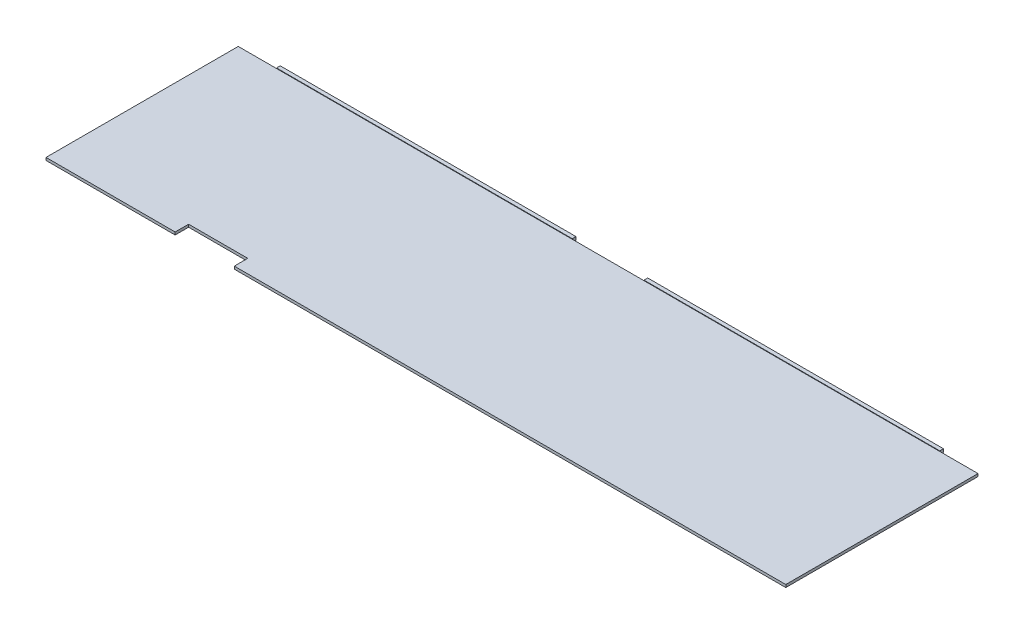
ISO-10303-21;
HEADER;
FILE_DESCRIPTION(('STEP AP214'),'2;1');
FILE_NAME('part.step','',(''),(''),'','','');
FILE_SCHEMA(('AUTOMOTIVE_DESIGN { 1 0 10303 214 1 1 1 1 }'));
ENDSEC;
DATA;
#1=APPLICATION_CONTEXT('core data for automotive mechanical design processes');
#2=APPLICATION_PROTOCOL_DEFINITION('international standard','automotive_design',2000,#1);
#3=PRODUCT_CONTEXT('',#1,'mechanical');
#4=PRODUCT('Part','Part','',(#3));
#5=PRODUCT_RELATED_PRODUCT_CATEGORY('part','',(#4));
#6=PRODUCT_DEFINITION_FORMATION('','',#4);
#7=PRODUCT_DEFINITION_CONTEXT('part definition',#1,'design');
#8=PRODUCT_DEFINITION('design','',#6,#7);
#9=PRODUCT_DEFINITION_SHAPE('','',#8);
#10=(LENGTH_UNIT() NAMED_UNIT(*) SI_UNIT(.MILLI.,.METRE.));
#11=(NAMED_UNIT(*) PLANE_ANGLE_UNIT() SI_UNIT($,.RADIAN.));
#12=(NAMED_UNIT(*) SI_UNIT($,.STERADIAN.) SOLID_ANGLE_UNIT());
#13=UNCERTAINTY_MEASURE_WITH_UNIT(LENGTH_MEASURE(1.E-05),#10,'distance_accuracy_value','');
#14=(GEOMETRIC_REPRESENTATION_CONTEXT(3) GLOBAL_UNCERTAINTY_ASSIGNED_CONTEXT((#13)) GLOBAL_UNIT_ASSIGNED_CONTEXT((#10,
#11,#12)) REPRESENTATION_CONTEXT('',''));
#15=CARTESIAN_POINT('',(0.,0.,0.));
#16=DIRECTION('',(0.,0.,1.));
#17=DIRECTION('',(1.,0.,0.));
#18=AXIS2_PLACEMENT_3D('',#15,#16,#17);
#19=CARTESIAN_POINT('',(-317.6778,1.143,82.55));
#20=DIRECTION('',(0.,0.,-1.));
#21=DIRECTION('',(-1.,0.,0.));
#22=AXIS2_PLACEMENT_3D('',#19,#20,#21);
#23=PLANE('',#22);
#24=DIRECTION('',(0.,1.,0.));
#25=VECTOR('',#24,1.);
#26=CARTESIAN_POINT('',(-155.970930865136,1.143,82.55));
#27=LINE('',#26,#25);
#28=CARTESIAN_POINT('',(-155.970930865136,-1.143,82.55));
#29=VERTEX_POINT('',#28);
#30=CARTESIAN_POINT('',(-155.970930865136,1.143,82.55));
#31=VERTEX_POINT('',#30);
#32=EDGE_CURVE('E187',#29,#31,#27,.T.);
#33=ORIENTED_EDGE('',*,*,#32,.F.);
#34=DIRECTION('',(1.,0.,0.));
#35=VECTOR('',#34,1.);
#36=CARTESIAN_POINT('',(-317.6778,-1.143,82.55));
#37=LINE('',#36,#35);
#38=CARTESIAN_POINT('',(317.6778,-1.143,82.55));
#39=VERTEX_POINT('',#38);
#40=EDGE_CURVE('E278',#29,#39,#37,.T.);
#41=ORIENTED_EDGE('',*,*,#40,.T.);
#42=DIRECTION('',(0.,-1.,0.));
#43=VECTOR('',#42,1.);
#44=CARTESIAN_POINT('',(317.6778,1.143,82.55));
#45=LINE('',#44,#43);
#46=CARTESIAN_POINT('',(317.6778,1.143,82.55));
#47=VERTEX_POINT('',#46);
#48=EDGE_CURVE('E269',#47,#39,#45,.T.);
#49=ORIENTED_EDGE('',*,*,#48,.F.);
#50=DIRECTION('',(1.,0.,0.));
#51=VECTOR('',#50,1.);
#52=CARTESIAN_POINT('',(-317.6778,1.143,82.55));
#53=LINE('',#52,#51);
#54=EDGE_CURVE('E265',#31,#47,#53,.T.);
#55=ORIENTED_EDGE('',*,*,#54,.F.);
#56=EDGE_LOOP('',(#33,#41,#49,#55));
#57=FACE_BOUND('',#56,.T.);
#58=ADVANCED_FACE('F33',(#57),#23,.F.);
#59=CARTESIAN_POINT('',(0.,1.143,0.));
#60=DIRECTION('',(0.,1.,0.));
#61=DIRECTION('',(0.,0.,1.));
#62=AXIS2_PLACEMENT_3D('',#59,#60,#61);
#63=PLANE('',#62);
#64=DIRECTION('',(-1.,0.,0.));
#65=VECTOR('',#64,1.);
#66=CARTESIAN_POINT('',(5.95291989389155E-13,1.143,70.977480805472));
#67=LINE('',#66,#65);
#68=CARTESIAN_POINT('',(-155.970930865136,1.143,70.9774808054733));
#69=VERTEX_POINT('',#68);
#70=CARTESIAN_POINT('',(-206.770930865136,1.143,70.9774808054754));
#71=VERTEX_POINT('',#70);
#72=EDGE_CURVE('E166',#69,#71,#67,.T.);
#73=ORIENTED_EDGE('',*,*,#72,.F.);
#74=DIRECTION('',(0.,0.,1.));
#75=VECTOR('',#74,1.);
#76=CARTESIAN_POINT('',(-155.970930865136,1.143,0.));
#77=LINE('',#76,#75);
#78=EDGE_CURVE('E184',#69,#31,#77,.T.);
#79=ORIENTED_EDGE('',*,*,#78,.T.);
#80=ORIENTED_EDGE('',*,*,#54,.T.);
#81=DIRECTION('',(0.,0.,-1.));
#82=VECTOR('',#81,1.);
#83=CARTESIAN_POINT('',(317.6778,1.143,-82.55));
#84=LINE('',#83,#82);
#85=CARTESIAN_POINT('',(317.6778,1.143,-82.55));
#86=VERTEX_POINT('',#85);
#87=EDGE_CURVE('E254',#47,#86,#84,.T.);
#88=ORIENTED_EDGE('',*,*,#87,.T.);
#89=DIRECTION('',(-1.,0.,0.));
#90=VECTOR('',#89,1.);
#91=CARTESIAN_POINT('',(-317.6778,1.143,-82.55));
#92=LINE('',#91,#90);
#93=CARTESIAN_POINT('',(284.822900000001,1.143,-82.55));
#94=VERTEX_POINT('',#93);
#95=EDGE_CURVE('E259',#86,#94,#92,.T.);
#96=ORIENTED_EDGE('',*,*,#95,.T.);
#97=DIRECTION('',(1.,0.,0.));
#98=VECTOR('',#97,1.);
#99=CARTESIAN_POINT('',(0.,1.143,-82.55));
#100=LINE('',#99,#98);
#101=CARTESIAN_POINT('',(30.8229000000014,1.143,-82.55));
#102=VERTEX_POINT('',#101);
#103=EDGE_CURVE('E220',#102,#94,#100,.T.);
#104=ORIENTED_EDGE('',*,*,#103,.F.);
#105=CARTESIAN_POINT('',(-30.8229000000015,1.143,-82.55));
#106=VERTEX_POINT('',#105);
#107=EDGE_CURVE('E56',#102,#106,#92,.T.);
#108=ORIENTED_EDGE('',*,*,#107,.T.);
#109=CARTESIAN_POINT('',(-284.822900000001,1.143,-82.55));
#110=VERTEX_POINT('',#109);
#111=EDGE_CURVE('E263',#106,#110,#92,.T.);
#112=ORIENTED_EDGE('',*,*,#111,.T.);
#113=CARTESIAN_POINT('',(-317.6778,1.143,-82.55));
#114=VERTEX_POINT('',#113);
#115=EDGE_CURVE('E257',#110,#114,#92,.T.);
#116=ORIENTED_EDGE('',*,*,#115,.T.);
#117=DIRECTION('',(0.,0.,1.));
#118=VECTOR('',#117,1.);
#119=CARTESIAN_POINT('',(-317.6778,1.143,-82.55));
#120=LINE('',#119,#118);
#121=CARTESIAN_POINT('',(-317.6778,1.143,82.55));
#122=VERTEX_POINT('',#121);
#123=EDGE_CURVE('E262',#114,#122,#120,.T.);
#124=ORIENTED_EDGE('',*,*,#123,.T.);
#125=CARTESIAN_POINT('',(-206.770930865136,1.143,82.55));
#126=VERTEX_POINT('',#125);
#127=EDGE_CURVE('E266',#122,#126,#53,.T.);
#128=ORIENTED_EDGE('',*,*,#127,.T.);
#129=DIRECTION('',(0.,0.,1.));
#130=VECTOR('',#129,1.);
#131=CARTESIAN_POINT('',(-206.770930865136,1.143,1.00828762200307E-12));
#132=LINE('',#131,#130);
#133=EDGE_CURVE('E179',#71,#126,#132,.T.);
#134=ORIENTED_EDGE('',*,*,#133,.F.);
#135=EDGE_LOOP('',(#73,#79,#80,#88,#96,#104,#108,#112,#116,#124,#128,#134));
#136=FACE_BOUND('',#135,.T.);
#137=ADVANCED_FACE('F315',(#136),#63,.T.);
#138=CARTESIAN_POINT('',(0.,-1.143,0.));
#139=DIRECTION('',(0.,1.,0.));
#140=DIRECTION('',(0.,0.,1.));
#141=AXIS2_PLACEMENT_3D('',#138,#139,#140);
#142=PLANE('',#141);
#143=DIRECTION('',(0.,0.,1.));
#144=VECTOR('',#143,1.);
#145=CARTESIAN_POINT('',(-155.970930865136,-1.143,0.));
#146=LINE('',#145,#144);
#147=CARTESIAN_POINT('',(-155.970930865136,-1.143,70.9774808054733));
#148=VERTEX_POINT('',#147);
#149=EDGE_CURVE('E11',#148,#29,#146,.T.);
#150=ORIENTED_EDGE('',*,*,#149,.F.);
#151=DIRECTION('',(1.,0.,0.));
#152=VECTOR('',#151,1.);
#153=CARTESIAN_POINT('',(5.95291989389155E-13,-1.143,70.977480805472));
#154=LINE('',#153,#152);
#155=CARTESIAN_POINT('',(-206.770930865136,-1.143,70.9774808054754));
#156=VERTEX_POINT('',#155);
#157=EDGE_CURVE('E163',#156,#148,#154,.T.);
#158=ORIENTED_EDGE('',*,*,#157,.F.);
#159=DIRECTION('',(0.,0.,1.));
#160=VECTOR('',#159,1.);
#161=CARTESIAN_POINT('',(-206.770930865136,-1.143,1.00828762200307E-12));
#162=LINE('',#161,#160);
#163=CARTESIAN_POINT('',(-206.770930865136,-1.143,82.55));
#164=VERTEX_POINT('',#163);
#165=EDGE_CURVE('E41',#156,#164,#162,.T.);
#166=ORIENTED_EDGE('',*,*,#165,.T.);
#167=CARTESIAN_POINT('',(-317.6778,-1.143,82.55));
#168=VERTEX_POINT('',#167);
#169=EDGE_CURVE('E258',#168,#164,#37,.T.);
#170=ORIENTED_EDGE('',*,*,#169,.F.);
#171=DIRECTION('',(0.,0.,1.));
#172=VECTOR('',#171,1.);
#173=CARTESIAN_POINT('',(-317.6778,-1.143,-82.55));
#174=LINE('',#173,#172);
#175=CARTESIAN_POINT('',(-317.6778,-1.143,-82.55));
#176=VERTEX_POINT('',#175);
#177=EDGE_CURVE('E275',#176,#168,#174,.T.);
#178=ORIENTED_EDGE('',*,*,#177,.F.);
#179=DIRECTION('',(-1.,0.,0.));
#180=VECTOR('',#179,1.);
#181=CARTESIAN_POINT('',(-317.6778,-1.143,-82.55));
#182=LINE('',#181,#180);
#183=CARTESIAN_POINT('',(-284.822900000001,-1.143,-82.55));
#184=VERTEX_POINT('',#183);
#185=EDGE_CURVE('E272',#184,#176,#182,.T.);
#186=ORIENTED_EDGE('',*,*,#185,.F.);
#187=DIRECTION('',(0.,0.,1.));
#188=VECTOR('',#187,1.);
#189=CARTESIAN_POINT('',(-284.822900000001,-1.143,-85.725));
#190=LINE('',#189,#188);
#191=CARTESIAN_POINT('',(-284.822900000001,-1.143,-85.725));
#192=VERTEX_POINT('',#191);
#193=EDGE_CURVE('E247',#192,#184,#190,.T.);
#194=ORIENTED_EDGE('',*,*,#193,.F.);
#195=DIRECTION('',(-1.,0.,0.));
#196=VECTOR('',#195,1.);
#197=CARTESIAN_POINT('',(-30.8229000000015,-1.143,-85.725));
#198=LINE('',#197,#196);
#199=CARTESIAN_POINT('',(-30.8229000000015,-1.143,-85.725));
#200=VERTEX_POINT('',#199);
#201=EDGE_CURVE('E227',#200,#192,#198,.T.);
#202=ORIENTED_EDGE('',*,*,#201,.F.);
#203=DIRECTION('',(0.,0.,1.));
#204=VECTOR('',#203,1.);
#205=CARTESIAN_POINT('',(-30.8229000000015,-1.143,-85.725));
#206=LINE('',#205,#204);
#207=CARTESIAN_POINT('',(-30.8229000000015,-1.143,-82.55));
#208=VERTEX_POINT('',#207);
#209=EDGE_CURVE('E250',#200,#208,#206,.T.);
#210=ORIENTED_EDGE('',*,*,#209,.T.);
#211=CARTESIAN_POINT('',(30.8229000000015,-1.143,-82.55));
#212=VERTEX_POINT('',#211);
#213=EDGE_CURVE('E276',#212,#208,#182,.T.);
#214=ORIENTED_EDGE('',*,*,#213,.F.);
#215=DIRECTION('',(0.,0.,1.));
#216=VECTOR('',#215,1.);
#217=CARTESIAN_POINT('',(30.8229000000015,-1.143,-85.725));
#218=LINE('',#217,#216);
#219=CARTESIAN_POINT('',(30.8229000000015,-1.143,-85.725));
#220=VERTEX_POINT('',#219);
#221=EDGE_CURVE('E214',#220,#212,#218,.T.);
#222=ORIENTED_EDGE('',*,*,#221,.F.);
#223=DIRECTION('',(-1.,0.,0.));
#224=VECTOR('',#223,1.);
#225=CARTESIAN_POINT('',(284.822900000001,-1.143,-85.725));
#226=LINE('',#225,#224);
#227=CARTESIAN_POINT('',(284.822900000001,-1.143,-85.725));
#228=VERTEX_POINT('',#227);
#229=EDGE_CURVE('E193',#228,#220,#226,.T.);
#230=ORIENTED_EDGE('',*,*,#229,.F.);
#231=DIRECTION('',(0.,0.,1.));
#232=VECTOR('',#231,1.);
#233=CARTESIAN_POINT('',(284.822900000001,-1.143,-85.725));
#234=LINE('',#233,#232);
#235=CARTESIAN_POINT('',(284.822900000001,-1.143,-82.55));
#236=VERTEX_POINT('',#235);
#237=EDGE_CURVE('E217',#228,#236,#234,.T.);
#238=ORIENTED_EDGE('',*,*,#237,.T.);
#239=CARTESIAN_POINT('',(317.6778,-1.143,-82.55));
#240=VERTEX_POINT('',#239);
#241=EDGE_CURVE('E273',#240,#236,#182,.T.);
#242=ORIENTED_EDGE('',*,*,#241,.F.);
#243=DIRECTION('',(0.,0.,-1.));
#244=VECTOR('',#243,1.);
#245=CARTESIAN_POINT('',(317.6778,-1.143,-82.55));
#246=LINE('',#245,#244);
#247=EDGE_CURVE('E253',#39,#240,#246,.T.);
#248=ORIENTED_EDGE('',*,*,#247,.F.);
#249=ORIENTED_EDGE('',*,*,#40,.F.);
#250=EDGE_LOOP('',(#150,#158,#166,#170,#178,#186,#194,#202,#210,#214,#222,#230,#238,#242,#248,#249));
#251=FACE_BOUND('',#250,.T.);
#252=ADVANCED_FACE('F175',(#251),#142,.F.);
#253=CARTESIAN_POINT('',(-317.6778,1.143,-82.55));
#254=DIRECTION('',(0.,0.,1.));
#255=DIRECTION('',(1.,0.,0.));
#256=AXIS2_PLACEMENT_3D('',#253,#254,#255);
#257=PLANE('',#256);
#258=DIRECTION('',(0.,-1.,0.));
#259=VECTOR('',#258,1.);
#260=CARTESIAN_POINT('',(284.822900000001,-1.143,-82.55));
#261=LINE('',#260,#259);
#262=EDGE_CURVE('E189',#94,#236,#261,.T.);
#263=ORIENTED_EDGE('',*,*,#262,.F.);
#264=ORIENTED_EDGE('',*,*,#95,.F.);
#265=DIRECTION('',(0.,-1.,0.));
#266=VECTOR('',#265,1.);
#267=CARTESIAN_POINT('',(317.6778,1.143,-82.55));
#268=LINE('',#267,#266);
#269=EDGE_CURVE('E288',#86,#240,#268,.T.);
#270=ORIENTED_EDGE('',*,*,#269,.T.);
#271=ORIENTED_EDGE('',*,*,#241,.T.);
#272=EDGE_LOOP('',(#263,#264,#270,#271));
#273=FACE_BOUND('',#272,.T.);
#274=ADVANCED_FACE('F354',(#273),#257,.F.);
#275=DIRECTION('',(0.,1.,0.));
#276=VECTOR('',#275,1.);
#277=CARTESIAN_POINT('',(30.8229000000015,1.58749999999994,-82.55));
#278=LINE('',#277,#276);
#279=EDGE_CURVE('E205',#212,#102,#278,.T.);
#280=ORIENTED_EDGE('',*,*,#279,.F.);
#281=ORIENTED_EDGE('',*,*,#213,.T.);
#282=DIRECTION('',(0.,-1.,0.));
#283=VECTOR('',#282,1.);
#284=CARTESIAN_POINT('',(-30.8229000000015,-1.143,-82.55));
#285=LINE('',#284,#283);
#286=EDGE_CURVE('E174',#106,#208,#285,.T.);
#287=ORIENTED_EDGE('',*,*,#286,.F.);
#288=ORIENTED_EDGE('',*,*,#107,.F.);
#289=EDGE_LOOP('',(#280,#281,#287,#288));
#290=FACE_BOUND('',#289,.T.);
#291=ADVANCED_FACE('F352',(#290),#257,.F.);
#292=DIRECTION('',(0.,1.,0.));
#293=VECTOR('',#292,1.);
#294=CARTESIAN_POINT('',(-284.822900000001,1.58749999999994,-82.55));
#295=LINE('',#294,#293);
#296=EDGE_CURVE('E238',#184,#110,#295,.T.);
#297=ORIENTED_EDGE('',*,*,#296,.F.);
#298=ORIENTED_EDGE('',*,*,#185,.T.);
#299=DIRECTION('',(0.,-1.,0.));
#300=VECTOR('',#299,1.);
#301=CARTESIAN_POINT('',(-317.6778,1.143,-82.55));
#302=LINE('',#301,#300);
#303=EDGE_CURVE('E285',#114,#176,#302,.T.);
#304=ORIENTED_EDGE('',*,*,#303,.F.);
#305=ORIENTED_EDGE('',*,*,#115,.F.);
#306=EDGE_LOOP('',(#297,#298,#304,#305));
#307=FACE_BOUND('',#306,.T.);
#308=ADVANCED_FACE('F319',(#307),#257,.F.);
#309=CARTESIAN_POINT('',(317.6778,1.143,-82.55));
#310=DIRECTION('',(-1.,0.,0.));
#311=DIRECTION('',(0.,0.,1.));
#312=AXIS2_PLACEMENT_3D('',#309,#310,#311);
#313=PLANE('',#312);
#314=ORIENTED_EDGE('',*,*,#247,.T.);
#315=ORIENTED_EDGE('',*,*,#269,.F.);
#316=ORIENTED_EDGE('',*,*,#87,.F.);
#317=ORIENTED_EDGE('',*,*,#48,.T.);
#318=EDGE_LOOP('',(#314,#315,#316,#317));
#319=FACE_BOUND('',#318,.T.);
#320=ADVANCED_FACE('F35',(#319),#313,.F.);
#321=CARTESIAN_POINT('',(-317.6778,1.143,-82.55));
#322=DIRECTION('',(1.,0.,0.));
#323=DIRECTION('',(0.,0.,-1.));
#324=AXIS2_PLACEMENT_3D('',#321,#322,#323);
#325=PLANE('',#324);
#326=ORIENTED_EDGE('',*,*,#177,.T.);
#327=DIRECTION('',(0.,-1.,0.));
#328=VECTOR('',#327,1.);
#329=CARTESIAN_POINT('',(-317.6778,1.143,82.55));
#330=LINE('',#329,#328);
#331=EDGE_CURVE('E282',#122,#168,#330,.T.);
#332=ORIENTED_EDGE('',*,*,#331,.F.);
#333=ORIENTED_EDGE('',*,*,#123,.F.);
#334=ORIENTED_EDGE('',*,*,#303,.T.);
#335=EDGE_LOOP('',(#326,#332,#333,#334));
#336=FACE_BOUND('',#335,.T.);
#337=ADVANCED_FACE('F322',(#336),#325,.F.);
#338=ORIENTED_EDGE('',*,*,#169,.T.);
#339=DIRECTION('',(0.,1.,0.));
#340=VECTOR('',#339,1.);
#341=CARTESIAN_POINT('',(-206.770930865136,1.143,82.55));
#342=LINE('',#341,#340);
#343=EDGE_CURVE('E48',#164,#126,#342,.T.);
#344=ORIENTED_EDGE('',*,*,#343,.T.);
#345=ORIENTED_EDGE('',*,*,#127,.F.);
#346=ORIENTED_EDGE('',*,*,#331,.T.);
#347=EDGE_LOOP('',(#338,#344,#345,#346));
#348=FACE_BOUND('',#347,.T.);
#349=ADVANCED_FACE('F325',(#348),#23,.F.);
#350=CARTESIAN_POINT('',(0.,0.,-82.55));
#351=DIRECTION('',(0.,0.,1.));
#352=DIRECTION('',(1.,0.,0.));
#353=AXIS2_PLACEMENT_3D('',#350,#351,#352);
#354=PLANE('',#353);
#355=ORIENTED_EDGE('',*,*,#111,.F.);
#356=CARTESIAN_POINT('',(-30.8229000000015,1.58749999999994,-82.55));
#357=VERTEX_POINT('',#356);
#358=EDGE_CURVE('E223',#357,#106,#285,.T.);
#359=ORIENTED_EDGE('',*,*,#358,.F.);
#360=DIRECTION('',(1.,0.,0.));
#361=VECTOR('',#360,1.);
#362=CARTESIAN_POINT('',(-30.8229000000015,1.58749999999994,-82.55));
#363=LINE('',#362,#361);
#364=CARTESIAN_POINT('',(-284.822900000001,1.58749999999994,-82.55));
#365=VERTEX_POINT('',#364);
#366=EDGE_CURVE('E228',#365,#357,#363,.T.);
#367=ORIENTED_EDGE('',*,*,#366,.F.);
#368=EDGE_CURVE('E237',#110,#365,#295,.T.);
#369=ORIENTED_EDGE('',*,*,#368,.F.);
#370=EDGE_LOOP('',(#355,#359,#367,#369));
#371=FACE_BOUND('',#370,.T.);
#372=ADVANCED_FACE('F310',(#371),#354,.T.);
#373=CARTESIAN_POINT('',(-30.8229000000015,-1.143,-85.725));
#374=DIRECTION('',(-1.,0.,0.));
#375=DIRECTION('',(0.,0.,1.));
#376=AXIS2_PLACEMENT_3D('',#373,#374,#375);
#377=PLANE('',#376);
#378=ORIENTED_EDGE('',*,*,#358,.T.);
#379=ORIENTED_EDGE('',*,*,#286,.T.);
#380=ORIENTED_EDGE('',*,*,#209,.F.);
#381=DIRECTION('',(0.,-1.,0.));
#382=VECTOR('',#381,1.);
#383=CARTESIAN_POINT('',(-30.8229000000015,-1.143,-85.725));
#384=LINE('',#383,#382);
#385=CARTESIAN_POINT('',(-30.8229000000015,1.58749999999994,-85.725));
#386=VERTEX_POINT('',#385);
#387=EDGE_CURVE('E224',#386,#200,#384,.T.);
#388=ORIENTED_EDGE('',*,*,#387,.F.);
#389=DIRECTION('',(0.,0.,1.));
#390=VECTOR('',#389,1.);
#391=CARTESIAN_POINT('',(-30.8229000000015,1.58749999999994,-85.725));
#392=LINE('',#391,#390);
#393=EDGE_CURVE('E234',#386,#357,#392,.T.);
#394=ORIENTED_EDGE('',*,*,#393,.T.);
#395=EDGE_LOOP('',(#378,#379,#380,#388,#394));
#396=FACE_BOUND('',#395,.T.);
#397=ADVANCED_FACE('F295',(#396),#377,.F.);
#398=CARTESIAN_POINT('',(-284.822900000001,1.58749999999994,-85.725));
#399=DIRECTION('',(1.,0.,0.));
#400=DIRECTION('',(0.,1.,0.));
#401=AXIS2_PLACEMENT_3D('',#398,#399,#400);
#402=PLANE('',#401);
#403=ORIENTED_EDGE('',*,*,#296,.T.);
#404=ORIENTED_EDGE('',*,*,#368,.T.);
#405=DIRECTION('',(0.,0.,1.));
#406=VECTOR('',#405,1.);
#407=CARTESIAN_POINT('',(-284.822900000001,1.58749999999994,-85.725));
#408=LINE('',#407,#406);
#409=CARTESIAN_POINT('',(-284.822900000001,1.58749999999994,-85.725));
#410=VERTEX_POINT('',#409);
#411=EDGE_CURVE('E244',#410,#365,#408,.T.);
#412=ORIENTED_EDGE('',*,*,#411,.F.);
#413=DIRECTION('',(0.,1.,0.));
#414=VECTOR('',#413,1.);
#415=CARTESIAN_POINT('',(-284.822900000001,1.58749999999994,-85.725));
#416=LINE('',#415,#414);
#417=EDGE_CURVE('E230',#192,#410,#416,.T.);
#418=ORIENTED_EDGE('',*,*,#417,.F.);
#419=ORIENTED_EDGE('',*,*,#193,.T.);
#420=EDGE_LOOP('',(#403,#404,#412,#418,#419));
#421=FACE_BOUND('',#420,.T.);
#422=ADVANCED_FACE('F402',(#421),#402,.F.);
#423=CARTESIAN_POINT('',(-30.8229000000015,1.58749999999994,-85.725));
#424=DIRECTION('',(0.,-1.,0.));
#425=DIRECTION('',(0.,0.,-1.));
#426=AXIS2_PLACEMENT_3D('',#423,#424,#425);
#427=PLANE('',#426);
#428=ORIENTED_EDGE('',*,*,#366,.T.);
#429=ORIENTED_EDGE('',*,*,#393,.F.);
#430=DIRECTION('',(1.,0.,0.));
#431=VECTOR('',#430,1.);
#432=CARTESIAN_POINT('',(-30.8229000000015,1.58749999999994,-85.725));
#433=LINE('',#432,#431);
#434=EDGE_CURVE('E232',#410,#386,#433,.T.);
#435=ORIENTED_EDGE('',*,*,#434,.F.);
#436=ORIENTED_EDGE('',*,*,#411,.T.);
#437=EDGE_LOOP('',(#428,#429,#435,#436));
#438=FACE_BOUND('',#437,.T.);
#439=ADVANCED_FACE('F411',(#438),#427,.F.);
#440=CARTESIAN_POINT('',(0.,0.,-85.725));
#441=DIRECTION('',(0.,0.,1.));
#442=DIRECTION('',(1.,0.,0.));
#443=AXIS2_PLACEMENT_3D('',#440,#441,#442);
#444=PLANE('',#443);
#445=ORIENTED_EDGE('',*,*,#387,.T.);
#446=ORIENTED_EDGE('',*,*,#201,.T.);
#447=ORIENTED_EDGE('',*,*,#417,.T.);
#448=ORIENTED_EDGE('',*,*,#434,.T.);
#449=EDGE_LOOP('',(#445,#446,#447,#448));
#450=FACE_BOUND('',#449,.T.);
#451=ADVANCED_FACE('F304',(#450),#444,.F.);
#452=CARTESIAN_POINT('',(284.822900000001,-1.143,-85.725));
#453=DIRECTION('',(-1.,0.,0.));
#454=DIRECTION('',(0.,-1.,0.));
#455=AXIS2_PLACEMENT_3D('',#452,#453,#454);
#456=PLANE('',#455);
#457=CARTESIAN_POINT('',(284.822900000001,1.58749999999994,-82.55));
#458=VERTEX_POINT('',#457);
#459=EDGE_CURVE('E201',#458,#94,#261,.T.);
#460=ORIENTED_EDGE('',*,*,#459,.T.);
#461=ORIENTED_EDGE('',*,*,#262,.T.);
#462=ORIENTED_EDGE('',*,*,#237,.F.);
#463=DIRECTION('',(0.,-1.,0.));
#464=VECTOR('',#463,1.);
#465=CARTESIAN_POINT('',(284.822900000001,-1.143,-85.725));
#466=LINE('',#465,#464);
#467=CARTESIAN_POINT('',(284.822900000001,1.58749999999994,-85.725));
#468=VERTEX_POINT('',#467);
#469=EDGE_CURVE('E190',#468,#228,#466,.T.);
#470=ORIENTED_EDGE('',*,*,#469,.F.);
#471=DIRECTION('',(0.,0.,1.));
#472=VECTOR('',#471,1.);
#473=CARTESIAN_POINT('',(284.822900000001,1.58749999999994,-85.725));
#474=LINE('',#473,#472);
#475=EDGE_CURVE('E200',#468,#458,#474,.T.);
#476=ORIENTED_EDGE('',*,*,#475,.T.);
#477=EDGE_LOOP('',(#460,#461,#462,#470,#476));
#478=FACE_BOUND('',#477,.T.);
#479=ADVANCED_FACE('F341',(#478),#456,.F.);
#480=CARTESIAN_POINT('',(30.8229000000015,1.58749999999994,-85.725));
#481=DIRECTION('',(1.,0.,0.));
#482=DIRECTION('',(0.,0.,-1.));
#483=AXIS2_PLACEMENT_3D('',#480,#481,#482);
#484=PLANE('',#483);
#485=ORIENTED_EDGE('',*,*,#279,.T.);
#486=CARTESIAN_POINT('',(30.8229000000015,1.58749999999994,-82.55));
#487=VERTEX_POINT('',#486);
#488=EDGE_CURVE('E204',#102,#487,#278,.T.);
#489=ORIENTED_EDGE('',*,*,#488,.T.);
#490=DIRECTION('',(0.,0.,1.));
#491=VECTOR('',#490,1.);
#492=CARTESIAN_POINT('',(30.8229000000015,1.58749999999994,-85.725));
#493=LINE('',#492,#491);
#494=CARTESIAN_POINT('',(30.8229000000015,1.58749999999994,-85.725));
#495=VERTEX_POINT('',#494);
#496=EDGE_CURVE('E211',#495,#487,#493,.T.);
#497=ORIENTED_EDGE('',*,*,#496,.F.);
#498=DIRECTION('',(0.,1.,0.));
#499=VECTOR('',#498,1.);
#500=CARTESIAN_POINT('',(30.8229000000015,1.58749999999994,-85.725));
#501=LINE('',#500,#499);
#502=EDGE_CURVE('E196',#220,#495,#501,.T.);
#503=ORIENTED_EDGE('',*,*,#502,.F.);
#504=ORIENTED_EDGE('',*,*,#221,.T.);
#505=EDGE_LOOP('',(#485,#489,#497,#503,#504));
#506=FACE_BOUND('',#505,.T.);
#507=ADVANCED_FACE('F351',(#506),#484,.F.);
#508=CARTESIAN_POINT('',(284.822900000001,1.58749999999994,-85.725));
#509=DIRECTION('',(0.,-1.,0.));
#510=DIRECTION('',(0.,0.,-1.));
#511=AXIS2_PLACEMENT_3D('',#508,#509,#510);
#512=PLANE('',#511);
#513=DIRECTION('',(1.,0.,0.));
#514=VECTOR('',#513,1.);
#515=CARTESIAN_POINT('',(284.822900000001,1.58749999999994,-82.55));
#516=LINE('',#515,#514);
#517=EDGE_CURVE('E194',#487,#458,#516,.T.);
#518=ORIENTED_EDGE('',*,*,#517,.T.);
#519=ORIENTED_EDGE('',*,*,#475,.F.);
#520=DIRECTION('',(1.,0.,0.));
#521=VECTOR('',#520,1.);
#522=CARTESIAN_POINT('',(284.822900000001,1.58749999999994,-85.725));
#523=LINE('',#522,#521);
#524=EDGE_CURVE('E198',#495,#468,#523,.T.);
#525=ORIENTED_EDGE('',*,*,#524,.F.);
#526=ORIENTED_EDGE('',*,*,#496,.T.);
#527=EDGE_LOOP('',(#518,#519,#525,#526));
#528=FACE_BOUND('',#527,.T.);
#529=ADVANCED_FACE('F347',(#528),#512,.F.);
#530=CARTESIAN_POINT('',(0.,0.,-85.725));
#531=DIRECTION('',(0.,0.,1.));
#532=DIRECTION('',(1.,0.,0.));
#533=AXIS2_PLACEMENT_3D('',#530,#531,#532);
#534=PLANE('',#533);
#535=ORIENTED_EDGE('',*,*,#469,.T.);
#536=ORIENTED_EDGE('',*,*,#229,.T.);
#537=ORIENTED_EDGE('',*,*,#502,.T.);
#538=ORIENTED_EDGE('',*,*,#524,.T.);
#539=EDGE_LOOP('',(#535,#536,#537,#538));
#540=FACE_BOUND('',#539,.T.);
#541=ADVANCED_FACE('F453',(#540),#534,.F.);
#542=CARTESIAN_POINT('',(0.,0.,-82.55));
#543=DIRECTION('',(0.,0.,1.));
#544=DIRECTION('',(1.,0.,0.));
#545=AXIS2_PLACEMENT_3D('',#542,#543,#544);
#546=PLANE('',#545);
#547=ORIENTED_EDGE('',*,*,#488,.F.);
#548=ORIENTED_EDGE('',*,*,#103,.T.);
#549=ORIENTED_EDGE('',*,*,#459,.F.);
#550=ORIENTED_EDGE('',*,*,#517,.F.);
#551=EDGE_LOOP('',(#547,#548,#549,#550));
#552=FACE_BOUND('',#551,.T.);
#553=ADVANCED_FACE('F337',(#552),#546,.T.);
#554=CARTESIAN_POINT('',(-155.970930865136,1.58749999999994,0.));
#555=DIRECTION('',(-1.,0.,0.));
#556=DIRECTION('',(0.,0.,1.));
#557=AXIS2_PLACEMENT_3D('',#554,#555,#556);
#558=PLANE('',#557);
#559=ORIENTED_EDGE('',*,*,#32,.T.);
#560=ORIENTED_EDGE('',*,*,#78,.F.);
#561=DIRECTION('',(0.,-1.,0.));
#562=VECTOR('',#561,1.);
#563=CARTESIAN_POINT('',(-155.970930865136,1.58749999999994,70.9774808054733));
#564=LINE('',#563,#562);
#565=EDGE_CURVE('E168',#69,#148,#564,.T.);
#566=ORIENTED_EDGE('',*,*,#565,.T.);
#567=ORIENTED_EDGE('',*,*,#149,.T.);
#568=EDGE_LOOP('',(#559,#560,#566,#567));
#569=FACE_BOUND('',#568,.T.);
#570=ADVANCED_FACE('F470',(#569),#558,.T.);
#571=CARTESIAN_POINT('',(-206.770930865136,1.58749999999994,1.00828762200307E-12));
#572=DIRECTION('',(-1.,0.,0.));
#573=DIRECTION('',(0.,0.,1.));
#574=AXIS2_PLACEMENT_3D('',#571,#572,#573);
#575=PLANE('',#574);
#576=ORIENTED_EDGE('',*,*,#165,.F.);
#577=DIRECTION('',(0.,-1.,0.));
#578=VECTOR('',#577,1.);
#579=CARTESIAN_POINT('',(-206.770930865136,1.58749999999994,70.9774808054754));
#580=LINE('',#579,#578);
#581=EDGE_CURVE('E159',#71,#156,#580,.T.);
#582=ORIENTED_EDGE('',*,*,#581,.F.);
#583=ORIENTED_EDGE('',*,*,#133,.T.);
#584=ORIENTED_EDGE('',*,*,#343,.F.);
#585=EDGE_LOOP('',(#576,#582,#583,#584));
#586=FACE_BOUND('',#585,.T.);
#587=ADVANCED_FACE('F170',(#586),#575,.F.);
#588=CARTESIAN_POINT('',(5.95291989389155E-13,1.58749999999994,70.977480805472));
#589=DIRECTION('',(0.,0.,-1.));
#590=DIRECTION('',(-1.,0.,0.));
#591=AXIS2_PLACEMENT_3D('',#588,#589,#590);
#592=PLANE('',#591);
#593=ORIENTED_EDGE('',*,*,#72,.T.);
#594=ORIENTED_EDGE('',*,*,#581,.T.);
#595=ORIENTED_EDGE('',*,*,#157,.T.);
#596=ORIENTED_EDGE('',*,*,#565,.F.);
#597=EDGE_LOOP('',(#593,#594,#595,#596));
#598=FACE_BOUND('',#597,.T.);
#599=ADVANCED_FACE('F160',(#598),#592,.F.);
#600=CLOSED_SHELL('',(#58,#137,#252,#274,#291,#308,#320,#337,#349,#372,#397,#422,#439,#451,#479,
#507,#529,#541,#553,#570,#587,#599));
#601=MANIFOLD_SOLID_BREP('B2',#600);
#602=ADVANCED_BREP_SHAPE_REPRESENTATION('',(#18,#601),#14);
#603=SHAPE_DEFINITION_REPRESENTATION(#9,#602);
ENDSEC;
END-ISO-10303-21;
